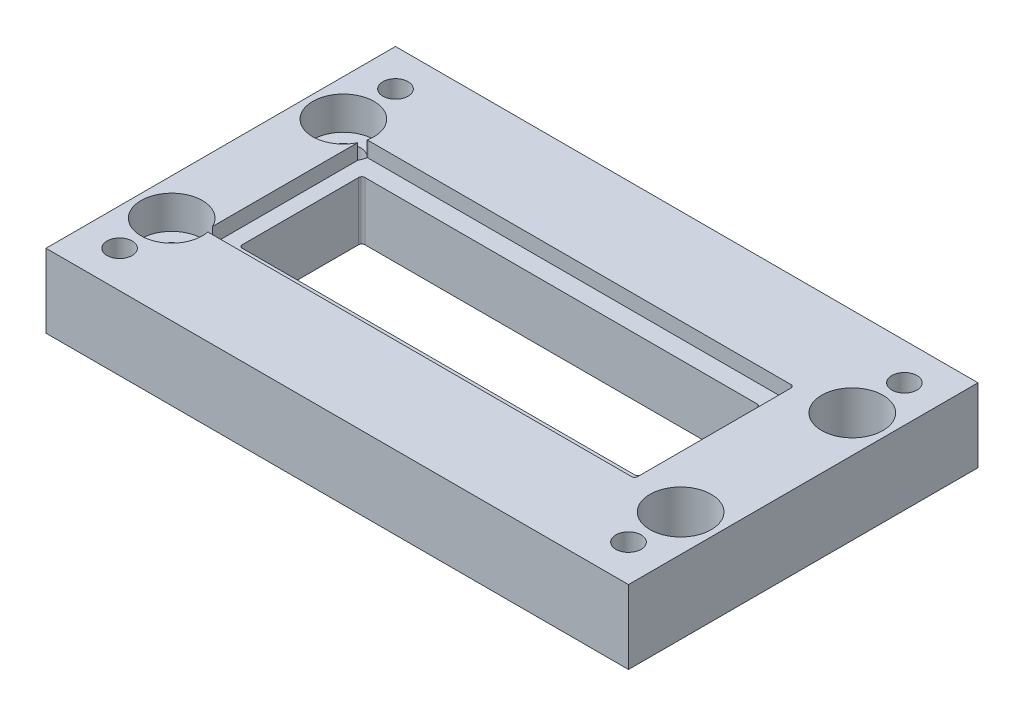
ISO-10303-21;
HEADER;
FILE_DESCRIPTION(('STEP AP214'),'2;1');
FILE_NAME('part.step','',(''),(''),'','','');
FILE_SCHEMA(('AUTOMOTIVE_DESIGN { 1 0 10303 214 1 1 1 1 }'));
ENDSEC;
DATA;
#1=APPLICATION_CONTEXT('core data for automotive mechanical design processes');
#2=APPLICATION_PROTOCOL_DEFINITION('international standard','automotive_design',2000,#1);
#3=PRODUCT_CONTEXT('',#1,'mechanical');
#4=PRODUCT('Part','Part','',(#3));
#5=PRODUCT_RELATED_PRODUCT_CATEGORY('part','',(#4));
#6=PRODUCT_DEFINITION_FORMATION('','',#4);
#7=PRODUCT_DEFINITION_CONTEXT('part definition',#1,'design');
#8=PRODUCT_DEFINITION('design','',#6,#7);
#9=PRODUCT_DEFINITION_SHAPE('','',#8);
#10=(LENGTH_UNIT() NAMED_UNIT(*) SI_UNIT(.MILLI.,.METRE.));
#11=(NAMED_UNIT(*) PLANE_ANGLE_UNIT() SI_UNIT($,.RADIAN.));
#12=(NAMED_UNIT(*) SI_UNIT($,.STERADIAN.) SOLID_ANGLE_UNIT());
#13=UNCERTAINTY_MEASURE_WITH_UNIT(LENGTH_MEASURE(1.E-05),#10,'distance_accuracy_value','');
#14=(GEOMETRIC_REPRESENTATION_CONTEXT(3) GLOBAL_UNCERTAINTY_ASSIGNED_CONTEXT((#13)) GLOBAL_UNIT_ASSIGNED_CONTEXT((#10,
#11,#12)) REPRESENTATION_CONTEXT('',''));
#15=CARTESIAN_POINT('',(0.,0.,0.));
#16=DIRECTION('',(0.,0.,1.));
#17=DIRECTION('',(1.,0.,0.));
#18=AXIS2_PLACEMENT_3D('',#15,#16,#17);
#19=CARTESIAN_POINT('',(-36.5,6.6,-14.));
#20=DIRECTION('',(0.,-1.,0.));
#21=DIRECTION('',(0.,0.,-1.));
#22=AXIS2_PLACEMENT_3D('',#19,#20,#21);
#23=PLANE('',#22);
#24=CARTESIAN_POINT('',(-41.5,6.6,-14.));
#25=DIRECTION('',(0.,1.,0.));
#26=DIRECTION('',(0.,0.,1.));
#27=AXIS2_PLACEMENT_3D('',#24,#25,#26);
#28=CIRCLE('',#27,5.);
#29=CARTESIAN_POINT('',(-41.5,6.6,-9.00000000000001));
#30=VERTEX_POINT('',#29);
#31=EDGE_CURVE('E427',#30,#30,#28,.T.);
#32=ORIENTED_EDGE('',*,*,#31,.T.);
#33=EDGE_LOOP('',(#32));
#34=FACE_BOUND('',#33,.T.);
#35=CARTESIAN_POINT('',(-41.5,6.6,-14.));
#36=DIRECTION('',(0.,1.,0.));
#37=DIRECTION('',(0.,0.,1.));
#38=AXIS2_PLACEMENT_3D('',#35,#36,#37);
#39=CIRCLE('',#38,2.75000000000001);
#40=CARTESIAN_POINT('',(-41.5,6.6,-11.25));
#41=VERTEX_POINT('',#40);
#42=EDGE_CURVE('E763',#41,#41,#39,.T.);
#43=ORIENTED_EDGE('',*,*,#42,.F.);
#44=EDGE_LOOP('',(#43));
#45=FACE_BOUND('',#44,.T.);
#46=ADVANCED_FACE('F49',(#34,#45),#23,.F.);
#47=CARTESIAN_POINT('',(-37.,12.,0.));
#48=DIRECTION('',(1.,0.,0.));
#49=DIRECTION('',(0.,0.,-1.));
#50=AXIS2_PLACEMENT_3D('',#47,#48,#49);
#51=PLANE('',#50);
#52=DIRECTION('',(0.,1.,0.));
#53=VECTOR('',#52,1.);
#54=CARTESIAN_POINT('',(-37.,12.,11.8205505282297));
#55=LINE('',#54,#53);
#56=CARTESIAN_POINT('',(-37.,9.5,11.8205505282297));
#57=VERTEX_POINT('',#56);
#58=CARTESIAN_POINT('',(-37.,12.,11.8205505282297));
#59=VERTEX_POINT('',#58);
#60=EDGE_CURVE('E64',#57,#59,#55,.T.);
#61=ORIENTED_EDGE('',*,*,#60,.F.);
#62=DIRECTION('',(0.,0.,1.));
#63=VECTOR('',#62,1.);
#64=CARTESIAN_POINT('',(-37.,9.5,0.));
#65=LINE('',#64,#63);
#66=CARTESIAN_POINT('',(-37.,9.5,-11.8205505282297));
#67=VERTEX_POINT('',#66);
#68=EDGE_CURVE('E309',#67,#57,#65,.T.);
#69=ORIENTED_EDGE('',*,*,#68,.F.);
#70=DIRECTION('',(0.,1.,0.));
#71=VECTOR('',#70,1.);
#72=CARTESIAN_POINT('',(-37.,12.,-11.8205505282297));
#73=LINE('',#72,#71);
#74=CARTESIAN_POINT('',(-37.,12.,-11.8205505282297));
#75=VERTEX_POINT('',#74);
#76=EDGE_CURVE('E53',#75,#67,#73,.F.);
#77=ORIENTED_EDGE('',*,*,#76,.F.);
#78=DIRECTION('',(0.,0.,1.));
#79=VECTOR('',#78,1.);
#80=CARTESIAN_POINT('',(-37.,12.,0.));
#81=LINE('',#80,#79);
#82=EDGE_CURVE('E386',#75,#59,#81,.T.);
#83=ORIENTED_EDGE('',*,*,#82,.T.);
#84=EDGE_LOOP('',(#61,#69,#77,#83));
#85=FACE_BOUND('',#84,.T.);
#86=ADVANCED_FACE('F420',(#85),#51,.T.);
#87=CARTESIAN_POINT('',(-36.5,12.,-12.5));
#88=DIRECTION('',(0.,-1.,0.));
#89=DIRECTION('',(0.,0.,-1.));
#90=AXIS2_PLACEMENT_3D('',#87,#88,#89);
#91=CYLINDRICAL_SURFACE('',#90,0.500000000000003);
#92=CARTESIAN_POINT('',(-36.5,12.,-12.5));
#93=DIRECTION('',(0.,1.,0.));
#94=DIRECTION('',(0.,0.,1.));
#95=AXIS2_PLACEMENT_3D('',#92,#93,#94);
#96=CIRCLE('',#95,0.500000000000003);
#97=CARTESIAN_POINT('',(-36.6032318616067,12.,-12.9892271279776));
#98=VERTEX_POINT('',#97);
#99=CARTESIAN_POINT('',(-36.5,12.,-13.));
#100=VERTEX_POINT('',#99);
#101=EDGE_CURVE('E388',#98,#100,#96,.F.);
#102=ORIENTED_EDGE('',*,*,#101,.F.);
#103=DIRECTION('',(0.,1.,0.));
#104=VECTOR('',#103,1.);
#105=CARTESIAN_POINT('',(-36.6032318616067,10.35,-12.9892271279776));
#106=LINE('',#105,#104);
#107=CARTESIAN_POINT('',(-36.6032318616067,9.5,-12.9892271279776));
#108=VERTEX_POINT('',#107);
#109=EDGE_CURVE('E72',#98,#108,#106,.F.);
#110=ORIENTED_EDGE('',*,*,#109,.T.);
#111=CARTESIAN_POINT('',(-36.5,9.5,-12.5));
#112=DIRECTION('',(0.,1.,0.));
#113=DIRECTION('',(0.,0.,1.));
#114=AXIS2_PLACEMENT_3D('',#111,#112,#113);
#115=CIRCLE('',#114,0.500000000000003);
#116=CARTESIAN_POINT('',(-36.5,9.5,-13.));
#117=VERTEX_POINT('',#116);
#118=EDGE_CURVE('E307',#108,#117,#115,.F.);
#119=ORIENTED_EDGE('',*,*,#118,.T.);
#120=DIRECTION('',(0.,-1.,0.));
#121=VECTOR('',#120,1.);
#122=CARTESIAN_POINT('',(-36.5,12.,-13.));
#123=LINE('',#122,#121);
#124=EDGE_CURVE('E268',#100,#117,#123,.T.);
#125=ORIENTED_EDGE('',*,*,#124,.F.);
#126=EDGE_LOOP('',(#102,#110,#119,#125));
#127=FACE_BOUND('',#126,.T.);
#128=ADVANCED_FACE('F418',(#127),#91,.F.);
#129=CARTESIAN_POINT('',(0.,12.,-13.));
#130=DIRECTION('',(0.,0.,1.));
#131=DIRECTION('',(1.,0.,0.));
#132=AXIS2_PLACEMENT_3D('',#129,#130,#131);
#133=PLANE('',#132);
#134=DIRECTION('',(-1.,0.,0.));
#135=VECTOR('',#134,1.);
#136=CARTESIAN_POINT('',(0.,9.5,-13.));
#137=LINE('',#136,#135);
#138=CARTESIAN_POINT('',(32.5,9.5,-13.));
#139=VERTEX_POINT('',#138);
#140=EDGE_CURVE('E324',#139,#117,#137,.T.);
#141=ORIENTED_EDGE('',*,*,#140,.F.);
#142=DIRECTION('',(0.,-1.,0.));
#143=VECTOR('',#142,1.);
#144=CARTESIAN_POINT('',(32.5,12.,-13.));
#145=LINE('',#144,#143);
#146=CARTESIAN_POINT('',(32.5,12.,-13.));
#147=VERTEX_POINT('',#146);
#148=EDGE_CURVE('E265',#147,#139,#145,.T.);
#149=ORIENTED_EDGE('',*,*,#148,.F.);
#150=DIRECTION('',(-1.,0.,0.));
#151=VECTOR('',#150,1.);
#152=CARTESIAN_POINT('',(0.,12.,-13.));
#153=LINE('',#152,#151);
#154=EDGE_CURVE('E390',#147,#100,#153,.T.);
#155=ORIENTED_EDGE('',*,*,#154,.T.);
#156=ORIENTED_EDGE('',*,*,#124,.T.);
#157=EDGE_LOOP('',(#141,#149,#155,#156));
#158=FACE_BOUND('',#157,.T.);
#159=ADVANCED_FACE('F414',(#158),#133,.T.);
#160=CARTESIAN_POINT('',(32.5,12.,-12.5));
#161=DIRECTION('',(0.,-1.,0.));
#162=DIRECTION('',(0.,0.,-1.));
#163=AXIS2_PLACEMENT_3D('',#160,#161,#162);
#164=CYLINDRICAL_SURFACE('',#163,0.5);
#165=ORIENTED_EDGE('',*,*,#148,.T.);
#166=CARTESIAN_POINT('',(32.5,9.5,-12.5));
#167=DIRECTION('',(0.,1.,0.));
#168=DIRECTION('',(0.,0.,1.));
#169=AXIS2_PLACEMENT_3D('',#166,#167,#168);
#170=CIRCLE('',#169,0.5);
#171=CARTESIAN_POINT('',(33.,9.5,-12.5));
#172=VERTEX_POINT('',#171);
#173=EDGE_CURVE('E321',#139,#172,#170,.F.);
#174=ORIENTED_EDGE('',*,*,#173,.T.);
#175=DIRECTION('',(0.,-1.,0.));
#176=VECTOR('',#175,1.);
#177=CARTESIAN_POINT('',(33.,12.,-12.5));
#178=LINE('',#177,#176);
#179=CARTESIAN_POINT('',(33.,12.,-12.5));
#180=VERTEX_POINT('',#179);
#181=EDGE_CURVE('E262',#180,#172,#178,.T.);
#182=ORIENTED_EDGE('',*,*,#181,.F.);
#183=CARTESIAN_POINT('',(32.5,12.,-12.5));
#184=DIRECTION('',(0.,1.,0.));
#185=DIRECTION('',(0.,0.,1.));
#186=AXIS2_PLACEMENT_3D('',#183,#184,#185);
#187=CIRCLE('',#186,0.5);
#188=EDGE_CURVE('E393',#147,#180,#187,.F.);
#189=ORIENTED_EDGE('',*,*,#188,.F.);
#190=EDGE_LOOP('',(#165,#174,#182,#189));
#191=FACE_BOUND('',#190,.T.);
#192=ADVANCED_FACE('F412',(#191),#164,.F.);
#193=CARTESIAN_POINT('',(33.,12.,0.));
#194=DIRECTION('',(1.,0.,0.));
#195=DIRECTION('',(0.,0.,-1.));
#196=AXIS2_PLACEMENT_3D('',#193,#194,#195);
#197=PLANE('',#196);
#198=ORIENTED_EDGE('',*,*,#181,.T.);
#199=DIRECTION('',(0.,0.,1.));
#200=VECTOR('',#199,1.);
#201=CARTESIAN_POINT('',(33.,9.5,0.));
#202=LINE('',#201,#200);
#203=CARTESIAN_POINT('',(33.,9.5,12.5));
#204=VERTEX_POINT('',#203);
#205=EDGE_CURVE('E318',#172,#204,#202,.T.);
#206=ORIENTED_EDGE('',*,*,#205,.T.);
#207=DIRECTION('',(0.,-1.,0.));
#208=VECTOR('',#207,1.);
#209=CARTESIAN_POINT('',(33.,12.,12.5));
#210=LINE('',#209,#208);
#211=CARTESIAN_POINT('',(33.,12.,12.5));
#212=VERTEX_POINT('',#211);
#213=EDGE_CURVE('E259',#212,#204,#210,.T.);
#214=ORIENTED_EDGE('',*,*,#213,.F.);
#215=DIRECTION('',(0.,0.,1.));
#216=VECTOR('',#215,1.);
#217=CARTESIAN_POINT('',(33.,12.,0.));
#218=LINE('',#217,#216);
#219=EDGE_CURVE('E396',#180,#212,#218,.T.);
#220=ORIENTED_EDGE('',*,*,#219,.F.);
#221=EDGE_LOOP('',(#198,#206,#214,#220));
#222=FACE_BOUND('',#221,.T.);
#223=ADVANCED_FACE('F406',(#222),#197,.F.);
#224=CARTESIAN_POINT('',(32.5,12.,12.5));
#225=DIRECTION('',(0.,-1.,0.));
#226=DIRECTION('',(0.,0.,-1.));
#227=AXIS2_PLACEMENT_3D('',#224,#225,#226);
#228=CYLINDRICAL_SURFACE('',#227,0.5);
#229=CARTESIAN_POINT('',(32.5,9.5,12.5));
#230=DIRECTION('',(0.,1.,0.));
#231=DIRECTION('',(0.,0.,1.));
#232=AXIS2_PLACEMENT_3D('',#229,#230,#231);
#233=CIRCLE('',#232,0.5);
#234=CARTESIAN_POINT('',(32.5,9.5,13.));
#235=VERTEX_POINT('',#234);
#236=EDGE_CURVE('E316',#235,#204,#233,.T.);
#237=ORIENTED_EDGE('',*,*,#236,.F.);
#238=DIRECTION('',(0.,-1.,0.));
#239=VECTOR('',#238,1.);
#240=CARTESIAN_POINT('',(32.5,12.,13.));
#241=LINE('',#240,#239);
#242=CARTESIAN_POINT('',(32.5,12.,13.));
#243=VERTEX_POINT('',#242);
#244=EDGE_CURVE('E255',#243,#235,#241,.T.);
#245=ORIENTED_EDGE('',*,*,#244,.F.);
#246=CARTESIAN_POINT('',(32.5,12.,12.5));
#247=DIRECTION('',(0.,1.,0.));
#248=DIRECTION('',(0.,0.,1.));
#249=AXIS2_PLACEMENT_3D('',#246,#247,#248);
#250=CIRCLE('',#249,0.5);
#251=EDGE_CURVE('E223',#243,#212,#250,.T.);
#252=ORIENTED_EDGE('',*,*,#251,.T.);
#253=ORIENTED_EDGE('',*,*,#213,.T.);
#254=EDGE_LOOP('',(#237,#245,#252,#253));
#255=FACE_BOUND('',#254,.T.);
#256=ADVANCED_FACE('F400',(#255),#228,.F.);
#257=CARTESIAN_POINT('',(0.,12.,13.));
#258=DIRECTION('',(0.,0.,1.));
#259=DIRECTION('',(1.,0.,0.));
#260=AXIS2_PLACEMENT_3D('',#257,#258,#259);
#261=PLANE('',#260);
#262=ORIENTED_EDGE('',*,*,#244,.T.);
#263=DIRECTION('',(-1.,0.,0.));
#264=VECTOR('',#263,1.);
#265=CARTESIAN_POINT('',(0.,9.5,13.));
#266=LINE('',#265,#264);
#267=CARTESIAN_POINT('',(-36.5,9.5,13.));
#268=VERTEX_POINT('',#267);
#269=EDGE_CURVE('E313',#235,#268,#266,.T.);
#270=ORIENTED_EDGE('',*,*,#269,.T.);
#271=DIRECTION('',(0.,-1.,0.));
#272=VECTOR('',#271,1.);
#273=CARTESIAN_POINT('',(-36.5,12.,13.));
#274=LINE('',#273,#272);
#275=CARTESIAN_POINT('',(-36.5,12.,13.));
#276=VERTEX_POINT('',#275);
#277=EDGE_CURVE('E253',#276,#268,#274,.T.);
#278=ORIENTED_EDGE('',*,*,#277,.F.);
#279=DIRECTION('',(-1.,0.,0.));
#280=VECTOR('',#279,1.);
#281=CARTESIAN_POINT('',(0.,12.,13.));
#282=LINE('',#281,#280);
#283=EDGE_CURVE('E217',#243,#276,#282,.T.);
#284=ORIENTED_EDGE('',*,*,#283,.F.);
#285=EDGE_LOOP('',(#262,#270,#278,#284));
#286=FACE_BOUND('',#285,.T.);
#287=ADVANCED_FACE('F447',(#286),#261,.F.);
#288=CARTESIAN_POINT('',(0.,12.,-28.5));
#289=DIRECTION('',(0.,0.,1.));
#290=DIRECTION('',(1.,0.,0.));
#291=AXIS2_PLACEMENT_3D('',#288,#289,#290);
#292=PLANE('',#291);
#293=DIRECTION('',(-1.,0.,0.));
#294=VECTOR('',#293,1.);
#295=CARTESIAN_POINT('',(0.,0.,-28.5));
#296=LINE('',#295,#294);
#297=CARTESIAN_POINT('',(47.5,0.,-28.5));
#298=VERTEX_POINT('',#297);
#299=CARTESIAN_POINT('',(-47.5,0.,-28.5));
#300=VERTEX_POINT('',#299);
#301=EDGE_CURVE('E240',#298,#300,#296,.T.);
#302=ORIENTED_EDGE('',*,*,#301,.T.);
#303=DIRECTION('',(0.,-1.,0.));
#304=VECTOR('',#303,1.);
#305=CARTESIAN_POINT('',(-47.5,12.,-28.5));
#306=LINE('',#305,#304);
#307=CARTESIAN_POINT('',(-47.5,12.,-28.5));
#308=VERTEX_POINT('',#307);
#309=EDGE_CURVE('E256',#308,#300,#306,.T.);
#310=ORIENTED_EDGE('',*,*,#309,.F.);
#311=DIRECTION('',(-1.,0.,0.));
#312=VECTOR('',#311,1.);
#313=CARTESIAN_POINT('',(0.,12.,-28.5));
#314=LINE('',#313,#312);
#315=CARTESIAN_POINT('',(47.5,12.,-28.5));
#316=VERTEX_POINT('',#315);
#317=EDGE_CURVE('E375',#316,#308,#314,.T.);
#318=ORIENTED_EDGE('',*,*,#317,.F.);
#319=DIRECTION('',(0.,-1.,0.));
#320=VECTOR('',#319,1.);
#321=CARTESIAN_POINT('',(47.5,12.,-28.5));
#322=LINE('',#321,#320);
#323=EDGE_CURVE('E219',#316,#298,#322,.T.);
#324=ORIENTED_EDGE('',*,*,#323,.T.);
#325=EDGE_LOOP('',(#302,#310,#318,#324));
#326=FACE_BOUND('',#325,.T.);
#327=ADVANCED_FACE('F449',(#326),#292,.F.);
#328=CARTESIAN_POINT('',(-47.5,12.,0.));
#329=DIRECTION('',(1.,0.,0.));
#330=DIRECTION('',(0.,0.,-1.));
#331=AXIS2_PLACEMENT_3D('',#328,#329,#330);
#332=PLANE('',#331);
#333=DIRECTION('',(0.,0.,1.));
#334=VECTOR('',#333,1.);
#335=CARTESIAN_POINT('',(-47.5,0.,0.));
#336=LINE('',#335,#334);
#337=CARTESIAN_POINT('',(-47.5,0.,28.5));
#338=VERTEX_POINT('',#337);
#339=EDGE_CURVE('E243',#300,#338,#336,.T.);
#340=ORIENTED_EDGE('',*,*,#339,.T.);
#341=DIRECTION('',(0.,-1.,0.));
#342=VECTOR('',#341,1.);
#343=CARTESIAN_POINT('',(-47.5,12.,28.5));
#344=LINE('',#343,#342);
#345=CARTESIAN_POINT('',(-47.5,12.,28.5));
#346=VERTEX_POINT('',#345);
#347=EDGE_CURVE('E273',#346,#338,#344,.T.);
#348=ORIENTED_EDGE('',*,*,#347,.F.);
#349=DIRECTION('',(0.,0.,1.));
#350=VECTOR('',#349,1.);
#351=CARTESIAN_POINT('',(-47.5,12.,0.));
#352=LINE('',#351,#350);
#353=EDGE_CURVE('E378',#308,#346,#352,.T.);
#354=ORIENTED_EDGE('',*,*,#353,.F.);
#355=ORIENTED_EDGE('',*,*,#309,.T.);
#356=EDGE_LOOP('',(#340,#348,#354,#355));
#357=FACE_BOUND('',#356,.T.);
#358=ADVANCED_FACE('F455',(#357),#332,.F.);
#359=CARTESIAN_POINT('',(0.,12.,28.5));
#360=DIRECTION('',(0.,0.,1.));
#361=DIRECTION('',(1.,0.,0.));
#362=AXIS2_PLACEMENT_3D('',#359,#360,#361);
#363=PLANE('',#362);
#364=DIRECTION('',(-1.,0.,0.));
#365=VECTOR('',#364,1.);
#366=CARTESIAN_POINT('',(0.,0.,28.5));
#367=LINE('',#366,#365);
#368=CARTESIAN_POINT('',(47.5,0.,28.5));
#369=VERTEX_POINT('',#368);
#370=EDGE_CURVE('E246',#369,#338,#367,.T.);
#371=ORIENTED_EDGE('',*,*,#370,.F.);
#372=DIRECTION('',(0.,-1.,0.));
#373=VECTOR('',#372,1.);
#374=CARTESIAN_POINT('',(47.5,12.,28.5));
#375=LINE('',#374,#373);
#376=CARTESIAN_POINT('',(47.5,12.,28.5));
#377=VERTEX_POINT('',#376);
#378=EDGE_CURVE('E221',#377,#369,#375,.T.);
#379=ORIENTED_EDGE('',*,*,#378,.F.);
#380=DIRECTION('',(-1.,0.,0.));
#381=VECTOR('',#380,1.);
#382=CARTESIAN_POINT('',(0.,12.,28.5));
#383=LINE('',#382,#381);
#384=EDGE_CURVE('E380',#377,#346,#383,.T.);
#385=ORIENTED_EDGE('',*,*,#384,.T.);
#386=ORIENTED_EDGE('',*,*,#347,.T.);
#387=EDGE_LOOP('',(#371,#379,#385,#386));
#388=FACE_BOUND('',#387,.T.);
#389=ADVANCED_FACE('F577',(#388),#363,.T.);
#390=CARTESIAN_POINT('',(47.5,12.,0.));
#391=DIRECTION('',(1.,0.,0.));
#392=DIRECTION('',(0.,0.,-1.));
#393=AXIS2_PLACEMENT_3D('',#390,#391,#392);
#394=PLANE('',#393);
#395=DIRECTION('',(0.,0.,1.));
#396=VECTOR('',#395,1.);
#397=CARTESIAN_POINT('',(47.5,0.,0.));
#398=LINE('',#397,#396);
#399=EDGE_CURVE('E249',#298,#369,#398,.T.);
#400=ORIENTED_EDGE('',*,*,#399,.F.);
#401=ORIENTED_EDGE('',*,*,#323,.F.);
#402=DIRECTION('',(0.,0.,1.));
#403=VECTOR('',#402,1.);
#404=CARTESIAN_POINT('',(47.5,12.,0.));
#405=LINE('',#404,#403);
#406=EDGE_CURVE('E383',#316,#377,#405,.T.);
#407=ORIENTED_EDGE('',*,*,#406,.T.);
#408=ORIENTED_EDGE('',*,*,#378,.T.);
#409=EDGE_LOOP('',(#400,#401,#407,#408));
#410=FACE_BOUND('',#409,.T.);
#411=ADVANCED_FACE('F571',(#410),#394,.T.);
#412=CARTESIAN_POINT('',(-41.5,12.,22.5));
#413=DIRECTION('',(0.,-1.,0.));
#414=DIRECTION('',(0.,0.,-1.));
#415=AXIS2_PLACEMENT_3D('',#412,#413,#414);
#416=CYLINDRICAL_SURFACE('',#415,2.05798302171012);
#417=CARTESIAN_POINT('',(-41.5,12.,22.5));
#418=DIRECTION('',(0.,1.,0.));
#419=DIRECTION('',(0.,0.,1.));
#420=AXIS2_PLACEMENT_3D('',#417,#418,#419);
#421=CIRCLE('',#420,2.05798302171012);
#422=CARTESIAN_POINT('',(-41.5,12.,24.5579830217101));
#423=VERTEX_POINT('',#422);
#424=EDGE_CURVE('E372',#423,#423,#421,.T.);
#425=ORIENTED_EDGE('',*,*,#424,.T.);
#426=EDGE_LOOP('',(#425));
#427=FACE_BOUND('',#426,.T.);
#428=CARTESIAN_POINT('',(-41.5,0.,22.5));
#429=DIRECTION('',(0.,1.,0.));
#430=DIRECTION('',(0.,0.,1.));
#431=AXIS2_PLACEMENT_3D('',#428,#429,#430);
#432=CIRCLE('',#431,2.05798302171012);
#433=CARTESIAN_POINT('',(-41.5,0.,24.5579830217101));
#434=VERTEX_POINT('',#433);
#435=EDGE_CURVE('E237',#434,#434,#432,.T.);
#436=ORIENTED_EDGE('',*,*,#435,.F.);
#437=EDGE_LOOP('',(#436));
#438=FACE_BOUND('',#437,.T.);
#439=ADVANCED_FACE('F589',(#427,#438),#416,.F.);
#440=CARTESIAN_POINT('',(41.5,12.,22.5));
#441=DIRECTION('',(0.,-1.,0.));
#442=DIRECTION('',(0.,0.,-1.));
#443=AXIS2_PLACEMENT_3D('',#440,#441,#442);
#444=CYLINDRICAL_SURFACE('',#443,2.05798302171012);
#445=CARTESIAN_POINT('',(41.5,12.,22.5));
#446=DIRECTION('',(0.,1.,0.));
#447=DIRECTION('',(0.,0.,1.));
#448=AXIS2_PLACEMENT_3D('',#445,#446,#447);
#449=CIRCLE('',#448,2.05798302171012);
#450=CARTESIAN_POINT('',(41.5,12.,24.5579830217101));
#451=VERTEX_POINT('',#450);
#452=EDGE_CURVE('E369',#451,#451,#449,.T.);
#453=ORIENTED_EDGE('',*,*,#452,.T.);
#454=EDGE_LOOP('',(#453));
#455=FACE_BOUND('',#454,.T.);
#456=CARTESIAN_POINT('',(41.5,0.,22.5));
#457=DIRECTION('',(0.,1.,0.));
#458=DIRECTION('',(0.,0.,1.));
#459=AXIS2_PLACEMENT_3D('',#456,#457,#458);
#460=CIRCLE('',#459,2.05798302171012);
#461=CARTESIAN_POINT('',(41.5,0.,24.5579830217101));
#462=VERTEX_POINT('',#461);
#463=EDGE_CURVE('E234',#462,#462,#460,.T.);
#464=ORIENTED_EDGE('',*,*,#463,.F.);
#465=EDGE_LOOP('',(#464));
#466=FACE_BOUND('',#465,.T.);
#467=ADVANCED_FACE('F534',(#455,#466),#444,.F.);
#468=CARTESIAN_POINT('',(-41.5,12.,-22.5));
#469=DIRECTION('',(0.,-1.,0.));
#470=DIRECTION('',(0.,0.,-1.));
#471=AXIS2_PLACEMENT_3D('',#468,#469,#470);
#472=CYLINDRICAL_SURFACE('',#471,2.05798302171012);
#473=CARTESIAN_POINT('',(-41.5,12.,-22.5));
#474=DIRECTION('',(0.,1.,0.));
#475=DIRECTION('',(0.,0.,1.));
#476=AXIS2_PLACEMENT_3D('',#473,#474,#475);
#477=CIRCLE('',#476,2.05798302171012);
#478=CARTESIAN_POINT('',(-41.5,12.,-20.4420169782899));
#479=VERTEX_POINT('',#478);
#480=EDGE_CURVE('E366',#479,#479,#477,.T.);
#481=ORIENTED_EDGE('',*,*,#480,.T.);
#482=EDGE_LOOP('',(#481));
#483=FACE_BOUND('',#482,.T.);
#484=CARTESIAN_POINT('',(-41.5,0.,-22.5));
#485=DIRECTION('',(0.,1.,0.));
#486=DIRECTION('',(0.,0.,1.));
#487=AXIS2_PLACEMENT_3D('',#484,#485,#486);
#488=CIRCLE('',#487,2.05798302171012);
#489=CARTESIAN_POINT('',(-41.5,0.,-20.4420169782899));
#490=VERTEX_POINT('',#489);
#491=EDGE_CURVE('E230',#490,#490,#488,.T.);
#492=ORIENTED_EDGE('',*,*,#491,.F.);
#493=EDGE_LOOP('',(#492));
#494=FACE_BOUND('',#493,.T.);
#495=ADVANCED_FACE('F529',(#483,#494),#472,.F.);
#496=CARTESIAN_POINT('',(41.5,12.,-22.5));
#497=DIRECTION('',(0.,-1.,0.));
#498=DIRECTION('',(0.,0.,-1.));
#499=AXIS2_PLACEMENT_3D('',#496,#497,#498);
#500=CYLINDRICAL_SURFACE('',#499,2.05798302171012);
#501=CARTESIAN_POINT('',(41.5,12.,-22.5));
#502=DIRECTION('',(0.,1.,0.));
#503=DIRECTION('',(0.,0.,1.));
#504=AXIS2_PLACEMENT_3D('',#501,#502,#503);
#505=CIRCLE('',#504,2.05798302171012);
#506=CARTESIAN_POINT('',(41.5,12.,-20.4420169782899));
#507=VERTEX_POINT('',#506);
#508=EDGE_CURVE('E252',#507,#507,#505,.T.);
#509=ORIENTED_EDGE('',*,*,#508,.T.);
#510=EDGE_LOOP('',(#509));
#511=FACE_BOUND('',#510,.T.);
#512=CARTESIAN_POINT('',(41.5,0.,-22.5));
#513=DIRECTION('',(0.,1.,0.));
#514=DIRECTION('',(0.,0.,1.));
#515=AXIS2_PLACEMENT_3D('',#512,#513,#514);
#516=CIRCLE('',#515,2.05798302171012);
#517=CARTESIAN_POINT('',(41.5,0.,-20.4420169782899));
#518=VERTEX_POINT('',#517);
#519=EDGE_CURVE('E227',#518,#518,#516,.T.);
#520=ORIENTED_EDGE('',*,*,#519,.F.);
#521=EDGE_LOOP('',(#520));
#522=FACE_BOUND('',#521,.T.);
#523=ADVANCED_FACE('F51',(#511,#522),#500,.F.);
#524=CARTESIAN_POINT('',(-36.5,12.,12.5));
#525=DIRECTION('',(0.,-1.,0.));
#526=DIRECTION('',(0.,0.,-1.));
#527=AXIS2_PLACEMENT_3D('',#524,#525,#526);
#528=CYLINDRICAL_SURFACE('',#527,0.5);
#529=CARTESIAN_POINT('',(-36.5,9.5,12.5));
#530=DIRECTION('',(0.,1.,0.));
#531=DIRECTION('',(0.,0.,1.));
#532=AXIS2_PLACEMENT_3D('',#529,#530,#531);
#533=CIRCLE('',#532,0.5);
#534=CARTESIAN_POINT('',(-36.6032318616067,9.5,12.9892271279776));
#535=VERTEX_POINT('',#534);
#536=EDGE_CURVE('E210',#268,#535,#533,.F.);
#537=ORIENTED_EDGE('',*,*,#536,.T.);
#538=DIRECTION('',(0.,1.,0.));
#539=VECTOR('',#538,1.);
#540=CARTESIAN_POINT('',(-36.6032318616067,10.35,12.9892271279776));
#541=LINE('',#540,#539);
#542=CARTESIAN_POINT('',(-36.6032318616067,12.,12.9892271279776));
#543=VERTEX_POINT('',#542);
#544=EDGE_CURVE('E198',#535,#543,#541,.T.);
#545=ORIENTED_EDGE('',*,*,#544,.T.);
#546=CARTESIAN_POINT('',(-36.5,12.,12.5));
#547=DIRECTION('',(0.,1.,0.));
#548=DIRECTION('',(0.,0.,1.));
#549=AXIS2_PLACEMENT_3D('',#546,#547,#548);
#550=CIRCLE('',#549,0.5);
#551=EDGE_CURVE('E208',#276,#543,#550,.F.);
#552=ORIENTED_EDGE('',*,*,#551,.F.);
#553=ORIENTED_EDGE('',*,*,#277,.T.);
#554=EDGE_LOOP('',(#537,#545,#552,#553));
#555=FACE_BOUND('',#554,.T.);
#556=ADVANCED_FACE('F206',(#555),#528,.F.);
#557=CARTESIAN_POINT('',(0.,12.,0.));
#558=DIRECTION('',(0.,1.,0.));
#559=DIRECTION('',(0.,0.,1.));
#560=AXIS2_PLACEMENT_3D('',#557,#558,#559);
#561=PLANE('',#560);
#562=CARTESIAN_POINT('',(41.5,12.,14.));
#563=DIRECTION('',(0.,1.,0.));
#564=DIRECTION('',(0.,0.,1.));
#565=AXIS2_PLACEMENT_3D('',#562,#563,#564);
#566=CIRCLE('',#565,5.);
#567=CARTESIAN_POINT('',(41.5,12.,19.));
#568=VERTEX_POINT('',#567);
#569=EDGE_CURVE('E433',#568,#568,#566,.T.);
#570=ORIENTED_EDGE('',*,*,#569,.F.);
#571=EDGE_LOOP('',(#570));
#572=FACE_BOUND('',#571,.T.);
#573=CARTESIAN_POINT('',(41.5,12.,-14.));
#574=DIRECTION('',(0.,1.,0.));
#575=DIRECTION('',(0.,0.,1.));
#576=AXIS2_PLACEMENT_3D('',#573,#574,#575);
#577=CIRCLE('',#576,5.);
#578=CARTESIAN_POINT('',(41.5,12.,-9.00000000000001));
#579=VERTEX_POINT('',#578);
#580=EDGE_CURVE('E442',#579,#579,#577,.T.);
#581=ORIENTED_EDGE('',*,*,#580,.F.);
#582=EDGE_LOOP('',(#581));
#583=FACE_BOUND('',#582,.T.);
#584=CARTESIAN_POINT('',(-41.5,12.,14.));
#585=DIRECTION('',(0.,1.,0.));
#586=DIRECTION('',(0.,0.,1.));
#587=AXIS2_PLACEMENT_3D('',#584,#585,#586);
#588=CIRCLE('',#587,5.);
#589=EDGE_CURVE('E13',#59,#543,#588,.T.);
#590=ORIENTED_EDGE('',*,*,#589,.F.);
#591=ORIENTED_EDGE('',*,*,#82,.F.);
#592=CARTESIAN_POINT('',(-41.5,12.,-14.));
#593=DIRECTION('',(0.,1.,0.));
#594=DIRECTION('',(0.,0.,1.));
#595=AXIS2_PLACEMENT_3D('',#592,#593,#594);
#596=CIRCLE('',#595,5.);
#597=EDGE_CURVE('E270',#98,#75,#596,.T.);
#598=ORIENTED_EDGE('',*,*,#597,.F.);
#599=ORIENTED_EDGE('',*,*,#101,.T.);
#600=ORIENTED_EDGE('',*,*,#154,.F.);
#601=ORIENTED_EDGE('',*,*,#188,.T.);
#602=ORIENTED_EDGE('',*,*,#219,.T.);
#603=ORIENTED_EDGE('',*,*,#251,.F.);
#604=ORIENTED_EDGE('',*,*,#283,.T.);
#605=ORIENTED_EDGE('',*,*,#551,.T.);
#606=EDGE_LOOP('',(#590,#591,#598,#599,#600,#601,#602,#603,#604,#605));
#607=FACE_BOUND('',#606,.T.);
#608=ORIENTED_EDGE('',*,*,#508,.F.);
#609=EDGE_LOOP('',(#608));
#610=FACE_BOUND('',#609,.T.);
#611=ORIENTED_EDGE('',*,*,#480,.F.);
#612=EDGE_LOOP('',(#611));
#613=FACE_BOUND('',#612,.T.);
#614=ORIENTED_EDGE('',*,*,#452,.F.);
#615=EDGE_LOOP('',(#614));
#616=FACE_BOUND('',#615,.T.);
#617=ORIENTED_EDGE('',*,*,#424,.F.);
#618=EDGE_LOOP('',(#617));
#619=FACE_BOUND('',#618,.T.);
#620=ORIENTED_EDGE('',*,*,#317,.T.);
#621=ORIENTED_EDGE('',*,*,#353,.T.);
#622=ORIENTED_EDGE('',*,*,#384,.F.);
#623=ORIENTED_EDGE('',*,*,#406,.F.);
#624=EDGE_LOOP('',(#620,#621,#622,#623));
#625=FACE_BOUND('',#624,.T.);
#626=ADVANCED_FACE('F213',(#572,#583,#607,#610,#613,#616,#619,#625),#561,.T.);
#627=CARTESIAN_POINT('',(0.,0.,0.));
#628=DIRECTION('',(0.,1.,0.));
#629=DIRECTION('',(0.,0.,1.));
#630=AXIS2_PLACEMENT_3D('',#627,#628,#629);
#631=PLANE('',#630);
#632=CARTESIAN_POINT('',(41.5,0.,-14.));
#633=DIRECTION('',(0.,1.,0.));
#634=DIRECTION('',(0.,0.,1.));
#635=AXIS2_PLACEMENT_3D('',#632,#633,#634);
#636=CIRCLE('',#635,2.75);
#637=CARTESIAN_POINT('',(41.5,0.,-11.25));
#638=VERTEX_POINT('',#637);
#639=EDGE_CURVE('E758',#638,#638,#636,.T.);
#640=ORIENTED_EDGE('',*,*,#639,.T.);
#641=EDGE_LOOP('',(#640));
#642=FACE_BOUND('',#641,.T.);
#643=CARTESIAN_POINT('',(-41.5,0.,-14.));
#644=DIRECTION('',(0.,1.,0.));
#645=DIRECTION('',(0.,0.,1.));
#646=AXIS2_PLACEMENT_3D('',#643,#644,#645);
#647=CIRCLE('',#646,2.75000000000001);
#648=CARTESIAN_POINT('',(-41.5,0.,-11.25));
#649=VERTEX_POINT('',#648);
#650=EDGE_CURVE('E766',#649,#649,#647,.T.);
#651=ORIENTED_EDGE('',*,*,#650,.T.);
#652=EDGE_LOOP('',(#651));
#653=FACE_BOUND('',#652,.T.);
#654=CARTESIAN_POINT('',(41.5,0.,14.));
#655=DIRECTION('',(0.,1.,0.));
#656=DIRECTION('',(0.,0.,1.));
#657=AXIS2_PLACEMENT_3D('',#654,#655,#656);
#658=CIRCLE('',#657,2.75);
#659=CARTESIAN_POINT('',(41.5,0.,16.75));
#660=VERTEX_POINT('',#659);
#661=EDGE_CURVE('E775',#660,#660,#658,.T.);
#662=ORIENTED_EDGE('',*,*,#661,.T.);
#663=EDGE_LOOP('',(#662));
#664=FACE_BOUND('',#663,.T.);
#665=CARTESIAN_POINT('',(-41.5,0.,14.));
#666=DIRECTION('',(0.,1.,0.));
#667=DIRECTION('',(0.,0.,1.));
#668=AXIS2_PLACEMENT_3D('',#665,#666,#667);
#669=CIRCLE('',#668,2.75);
#670=CARTESIAN_POINT('',(-41.5,0.,16.75));
#671=VERTEX_POINT('',#670);
#672=EDGE_CURVE('E430',#671,#671,#669,.T.);
#673=ORIENTED_EDGE('',*,*,#672,.T.);
#674=EDGE_LOOP('',(#673));
#675=FACE_BOUND('',#674,.T.);
#676=ORIENTED_EDGE('',*,*,#519,.T.);
#677=EDGE_LOOP('',(#676));
#678=FACE_BOUND('',#677,.T.);
#679=ORIENTED_EDGE('',*,*,#491,.T.);
#680=EDGE_LOOP('',(#679));
#681=FACE_BOUND('',#680,.T.);
#682=ORIENTED_EDGE('',*,*,#463,.T.);
#683=EDGE_LOOP('',(#682));
#684=FACE_BOUND('',#683,.T.);
#685=ORIENTED_EDGE('',*,*,#435,.T.);
#686=EDGE_LOOP('',(#685));
#687=FACE_BOUND('',#686,.T.);
#688=ORIENTED_EDGE('',*,*,#301,.F.);
#689=ORIENTED_EDGE('',*,*,#399,.T.);
#690=ORIENTED_EDGE('',*,*,#370,.T.);
#691=ORIENTED_EDGE('',*,*,#339,.F.);
#692=EDGE_LOOP('',(#688,#689,#690,#691));
#693=FACE_BOUND('',#692,.T.);
#694=CARTESIAN_POINT('',(30.,0.,9.49999999999999));
#695=DIRECTION('',(0.,1.,0.));
#696=DIRECTION('',(0.,0.,1.));
#697=AXIS2_PLACEMENT_3D('',#694,#695,#696);
#698=CIRCLE('',#697,0.5);
#699=CARTESIAN_POINT('',(30.,0.,9.99999999999999));
#700=VERTEX_POINT('',#699);
#701=CARTESIAN_POINT('',(30.5,0.,9.49999999999999));
#702=VERTEX_POINT('',#701);
#703=EDGE_CURVE('E284',#700,#702,#698,.T.);
#704=ORIENTED_EDGE('',*,*,#703,.T.);
#705=DIRECTION('',(0.,0.,-1.));
#706=VECTOR('',#705,1.);
#707=CARTESIAN_POINT('',(30.5,0.,0.));
#708=LINE('',#707,#706);
#709=CARTESIAN_POINT('',(30.5,0.,-9.5));
#710=VERTEX_POINT('',#709);
#711=EDGE_CURVE('E289',#702,#710,#708,.T.);
#712=ORIENTED_EDGE('',*,*,#711,.T.);
#713=CARTESIAN_POINT('',(30.,0.,-9.50000000000001));
#714=DIRECTION('',(0.,1.,0.));
#715=DIRECTION('',(0.,0.,1.));
#716=AXIS2_PLACEMENT_3D('',#713,#714,#715);
#717=CIRCLE('',#716,0.5);
#718=CARTESIAN_POINT('',(30.,0.,-10.));
#719=VERTEX_POINT('',#718);
#720=EDGE_CURVE('E343',#710,#719,#717,.T.);
#721=ORIENTED_EDGE('',*,*,#720,.T.);
#722=DIRECTION('',(-1.,0.,0.));
#723=VECTOR('',#722,1.);
#724=CARTESIAN_POINT('',(0.,0.,-10.));
#725=LINE('',#724,#723);
#726=CARTESIAN_POINT('',(-34.,0.,-10.));
#727=VERTEX_POINT('',#726);
#728=EDGE_CURVE('E340',#719,#727,#725,.T.);
#729=ORIENTED_EDGE('',*,*,#728,.T.);
#730=CARTESIAN_POINT('',(-34.,0.,-9.5));
#731=DIRECTION('',(0.,1.,0.));
#732=DIRECTION('',(0.,0.,1.));
#733=AXIS2_PLACEMENT_3D('',#730,#731,#732);
#734=CIRCLE('',#733,0.5);
#735=CARTESIAN_POINT('',(-34.5,0.,-9.49999999999999));
#736=VERTEX_POINT('',#735);
#737=EDGE_CURVE('E337',#727,#736,#734,.T.);
#738=ORIENTED_EDGE('',*,*,#737,.T.);
#739=DIRECTION('',(0.,0.,-1.));
#740=VECTOR('',#739,1.);
#741=CARTESIAN_POINT('',(-34.5,0.,0.));
#742=LINE('',#741,#740);
#743=CARTESIAN_POINT('',(-34.5,0.,9.5));
#744=VERTEX_POINT('',#743);
#745=EDGE_CURVE('E334',#744,#736,#742,.T.);
#746=ORIENTED_EDGE('',*,*,#745,.F.);
#747=CARTESIAN_POINT('',(-34.,0.,9.5));
#748=DIRECTION('',(0.,1.,0.));
#749=DIRECTION('',(0.,0.,1.));
#750=AXIS2_PLACEMENT_3D('',#747,#748,#749);
#751=CIRCLE('',#750,0.5);
#752=CARTESIAN_POINT('',(-34.,0.,10.));
#753=VERTEX_POINT('',#752);
#754=EDGE_CURVE('E332',#753,#744,#751,.F.);
#755=ORIENTED_EDGE('',*,*,#754,.F.);
#756=DIRECTION('',(-1.,0.,0.));
#757=VECTOR('',#756,1.);
#758=CARTESIAN_POINT('',(0.,0.,10.));
#759=LINE('',#758,#757);
#760=EDGE_CURVE('E330',#700,#753,#759,.T.);
#761=ORIENTED_EDGE('',*,*,#760,.F.);
#762=EDGE_LOOP('',(#704,#712,#721,#729,#738,#746,#755,#761));
#763=FACE_BOUND('',#762,.T.);
#764=ADVANCED_FACE('F518',(#642,#653,#664,#675,#678,#681,#684,#687,#693,#763),#631,.F.);
#765=CARTESIAN_POINT('',(30.,9.5,9.49999999999999));
#766=DIRECTION('',(0.,-1.,0.));
#767=DIRECTION('',(0.,0.,-1.));
#768=AXIS2_PLACEMENT_3D('',#765,#766,#767);
#769=CYLINDRICAL_SURFACE('',#768,0.5);
#770=ORIENTED_EDGE('',*,*,#703,.F.);
#771=DIRECTION('',(0.,-1.,0.));
#772=VECTOR('',#771,1.);
#773=CARTESIAN_POINT('',(30.,9.5,9.99999999999999));
#774=LINE('',#773,#772);
#775=CARTESIAN_POINT('',(30.,9.5,9.99999999999999));
#776=VERTEX_POINT('',#775);
#777=EDGE_CURVE('E231',#776,#700,#774,.T.);
#778=ORIENTED_EDGE('',*,*,#777,.F.);
#779=CARTESIAN_POINT('',(30.,9.5,9.49999999999999));
#780=DIRECTION('',(0.,1.,0.));
#781=DIRECTION('',(0.,0.,1.));
#782=AXIS2_PLACEMENT_3D('',#779,#780,#781);
#783=CIRCLE('',#782,0.5);
#784=CARTESIAN_POINT('',(30.5,9.5,9.49999999999999));
#785=VERTEX_POINT('',#784);
#786=EDGE_CURVE('E285',#776,#785,#783,.T.);
#787=ORIENTED_EDGE('',*,*,#786,.T.);
#788=DIRECTION('',(0.,-1.,0.));
#789=VECTOR('',#788,1.);
#790=CARTESIAN_POINT('',(30.5,9.5,9.49999999999999));
#791=LINE('',#790,#789);
#792=EDGE_CURVE('E327',#785,#702,#791,.T.);
#793=ORIENTED_EDGE('',*,*,#792,.T.);
#794=EDGE_LOOP('',(#770,#778,#787,#793));
#795=FACE_BOUND('',#794,.T.);
#796=ADVANCED_FACE('F514',(#795),#769,.F.);
#797=CARTESIAN_POINT('',(0.,9.5,10.));
#798=DIRECTION('',(0.,0.,1.));
#799=DIRECTION('',(1.,0.,0.));
#800=AXIS2_PLACEMENT_3D('',#797,#798,#799);
#801=PLANE('',#800);
#802=ORIENTED_EDGE('',*,*,#760,.T.);
#803=DIRECTION('',(0.,-1.,0.));
#804=VECTOR('',#803,1.);
#805=CARTESIAN_POINT('',(-34.,9.5,10.));
#806=LINE('',#805,#804);
#807=CARTESIAN_POINT('',(-34.,9.5,10.));
#808=VERTEX_POINT('',#807);
#809=EDGE_CURVE('E360',#808,#753,#806,.T.);
#810=ORIENTED_EDGE('',*,*,#809,.F.);
#811=DIRECTION('',(-1.,0.,0.));
#812=VECTOR('',#811,1.);
#813=CARTESIAN_POINT('',(0.,9.5,10.));
#814=LINE('',#813,#812);
#815=EDGE_CURVE('E288',#776,#808,#814,.T.);
#816=ORIENTED_EDGE('',*,*,#815,.F.);
#817=ORIENTED_EDGE('',*,*,#777,.T.);
#818=EDGE_LOOP('',(#802,#810,#816,#817));
#819=FACE_BOUND('',#818,.T.);
#820=ADVANCED_FACE('F510',(#819),#801,.F.);
#821=CARTESIAN_POINT('',(-34.,9.5,9.5));
#822=DIRECTION('',(0.,-1.,0.));
#823=DIRECTION('',(0.,0.,-1.));
#824=AXIS2_PLACEMENT_3D('',#821,#822,#823);
#825=CYLINDRICAL_SURFACE('',#824,0.5);
#826=ORIENTED_EDGE('',*,*,#754,.T.);
#827=DIRECTION('',(0.,-1.,0.));
#828=VECTOR('',#827,1.);
#829=CARTESIAN_POINT('',(-34.5,9.5,9.5));
#830=LINE('',#829,#828);
#831=CARTESIAN_POINT('',(-34.5,9.5,9.5));
#832=VERTEX_POINT('',#831);
#833=EDGE_CURVE('E357',#832,#744,#830,.T.);
#834=ORIENTED_EDGE('',*,*,#833,.F.);
#835=CARTESIAN_POINT('',(-34.,9.5,9.5));
#836=DIRECTION('',(0.,1.,0.));
#837=DIRECTION('',(0.,0.,1.));
#838=AXIS2_PLACEMENT_3D('',#835,#836,#837);
#839=CIRCLE('',#838,0.5);
#840=EDGE_CURVE('E291',#808,#832,#839,.F.);
#841=ORIENTED_EDGE('',*,*,#840,.F.);
#842=ORIENTED_EDGE('',*,*,#809,.T.);
#843=EDGE_LOOP('',(#826,#834,#841,#842));
#844=FACE_BOUND('',#843,.T.);
#845=ADVANCED_FACE('F506',(#844),#825,.F.);
#846=CARTESIAN_POINT('',(-34.5,9.5,0.));
#847=DIRECTION('',(-1.,0.,0.));
#848=DIRECTION('',(0.,0.,1.));
#849=AXIS2_PLACEMENT_3D('',#846,#847,#848);
#850=PLANE('',#849);
#851=ORIENTED_EDGE('',*,*,#745,.T.);
#852=DIRECTION('',(0.,-1.,0.));
#853=VECTOR('',#852,1.);
#854=CARTESIAN_POINT('',(-34.5,9.5,-9.49999999999999));
#855=LINE('',#854,#853);
#856=CARTESIAN_POINT('',(-34.5,9.5,-9.49999999999999));
#857=VERTEX_POINT('',#856);
#858=EDGE_CURVE('E355',#857,#736,#855,.T.);
#859=ORIENTED_EDGE('',*,*,#858,.F.);
#860=DIRECTION('',(0.,0.,-1.));
#861=VECTOR('',#860,1.);
#862=CARTESIAN_POINT('',(-34.5,9.5,0.));
#863=LINE('',#862,#861);
#864=EDGE_CURVE('E293',#832,#857,#863,.T.);
#865=ORIENTED_EDGE('',*,*,#864,.F.);
#866=ORIENTED_EDGE('',*,*,#833,.T.);
#867=EDGE_LOOP('',(#851,#859,#865,#866));
#868=FACE_BOUND('',#867,.T.);
#869=ADVANCED_FACE('F502',(#868),#850,.F.);
#870=CARTESIAN_POINT('',(-34.,9.5,-9.5));
#871=DIRECTION('',(0.,-1.,0.));
#872=DIRECTION('',(0.,0.,-1.));
#873=AXIS2_PLACEMENT_3D('',#870,#871,#872);
#874=CYLINDRICAL_SURFACE('',#873,0.5);
#875=ORIENTED_EDGE('',*,*,#737,.F.);
#876=DIRECTION('',(0.,-1.,0.));
#877=VECTOR('',#876,1.);
#878=CARTESIAN_POINT('',(-34.,9.5,-10.));
#879=LINE('',#878,#877);
#880=CARTESIAN_POINT('',(-34.,9.5,-10.));
#881=VERTEX_POINT('',#880);
#882=EDGE_CURVE('E353',#881,#727,#879,.T.);
#883=ORIENTED_EDGE('',*,*,#882,.F.);
#884=CARTESIAN_POINT('',(-34.,9.5,-9.5));
#885=DIRECTION('',(0.,1.,0.));
#886=DIRECTION('',(0.,0.,1.));
#887=AXIS2_PLACEMENT_3D('',#884,#885,#886);
#888=CIRCLE('',#887,0.5);
#889=EDGE_CURVE('E295',#881,#857,#888,.T.);
#890=ORIENTED_EDGE('',*,*,#889,.T.);
#891=ORIENTED_EDGE('',*,*,#858,.T.);
#892=EDGE_LOOP('',(#875,#883,#890,#891));
#893=FACE_BOUND('',#892,.T.);
#894=ADVANCED_FACE('F498',(#893),#874,.F.);
#895=CARTESIAN_POINT('',(0.,9.5,-10.));
#896=DIRECTION('',(0.,0.,1.));
#897=DIRECTION('',(1.,0.,0.));
#898=AXIS2_PLACEMENT_3D('',#895,#896,#897);
#899=PLANE('',#898);
#900=ORIENTED_EDGE('',*,*,#728,.F.);
#901=DIRECTION('',(0.,-1.,0.));
#902=VECTOR('',#901,1.);
#903=CARTESIAN_POINT('',(30.,9.5,-10.));
#904=LINE('',#903,#902);
#905=CARTESIAN_POINT('',(30.,9.5,-10.));
#906=VERTEX_POINT('',#905);
#907=EDGE_CURVE('E351',#906,#719,#904,.T.);
#908=ORIENTED_EDGE('',*,*,#907,.F.);
#909=DIRECTION('',(-1.,0.,0.));
#910=VECTOR('',#909,1.);
#911=CARTESIAN_POINT('',(0.,9.5,-10.));
#912=LINE('',#911,#910);
#913=EDGE_CURVE('E298',#906,#881,#912,.T.);
#914=ORIENTED_EDGE('',*,*,#913,.T.);
#915=ORIENTED_EDGE('',*,*,#882,.T.);
#916=EDGE_LOOP('',(#900,#908,#914,#915));
#917=FACE_BOUND('',#916,.T.);
#918=ADVANCED_FACE('F494',(#917),#899,.T.);
#919=CARTESIAN_POINT('',(30.,9.5,-9.50000000000001));
#920=DIRECTION('',(0.,-1.,0.));
#921=DIRECTION('',(0.,0.,-1.));
#922=AXIS2_PLACEMENT_3D('',#919,#920,#921);
#923=CYLINDRICAL_SURFACE('',#922,0.5);
#924=ORIENTED_EDGE('',*,*,#720,.F.);
#925=DIRECTION('',(0.,-1.,0.));
#926=VECTOR('',#925,1.);
#927=CARTESIAN_POINT('',(30.5,9.5,-9.5));
#928=LINE('',#927,#926);
#929=CARTESIAN_POINT('',(30.5,9.5,-9.5));
#930=VERTEX_POINT('',#929);
#931=EDGE_CURVE('E349',#930,#710,#928,.T.);
#932=ORIENTED_EDGE('',*,*,#931,.F.);
#933=CARTESIAN_POINT('',(30.,9.5,-9.50000000000001));
#934=DIRECTION('',(0.,1.,0.));
#935=DIRECTION('',(0.,0.,1.));
#936=AXIS2_PLACEMENT_3D('',#933,#934,#935);
#937=CIRCLE('',#936,0.5);
#938=EDGE_CURVE('E301',#930,#906,#937,.T.);
#939=ORIENTED_EDGE('',*,*,#938,.T.);
#940=ORIENTED_EDGE('',*,*,#907,.T.);
#941=EDGE_LOOP('',(#924,#932,#939,#940));
#942=FACE_BOUND('',#941,.T.);
#943=ADVANCED_FACE('F490',(#942),#923,.F.);
#944=CARTESIAN_POINT('',(30.5,9.5,0.));
#945=DIRECTION('',(-1.,0.,0.));
#946=DIRECTION('',(0.,0.,1.));
#947=AXIS2_PLACEMENT_3D('',#944,#945,#946);
#948=PLANE('',#947);
#949=ORIENTED_EDGE('',*,*,#711,.F.);
#950=ORIENTED_EDGE('',*,*,#792,.F.);
#951=DIRECTION('',(0.,0.,-1.));
#952=VECTOR('',#951,1.);
#953=CARTESIAN_POINT('',(30.5,9.5,0.));
#954=LINE('',#953,#952);
#955=EDGE_CURVE('E304',#785,#930,#954,.T.);
#956=ORIENTED_EDGE('',*,*,#955,.T.);
#957=ORIENTED_EDGE('',*,*,#931,.T.);
#958=EDGE_LOOP('',(#949,#950,#956,#957));
#959=FACE_BOUND('',#958,.T.);
#960=ADVANCED_FACE('F487',(#959),#948,.T.);
#961=CARTESIAN_POINT('',(0.,9.5,0.));
#962=DIRECTION('',(0.,1.,0.));
#963=DIRECTION('',(0.,0.,1.));
#964=AXIS2_PLACEMENT_3D('',#961,#962,#963);
#965=PLANE('',#964);
#966=CARTESIAN_POINT('',(-41.5,9.5,14.));
#967=DIRECTION('',(0.,1.,0.));
#968=DIRECTION('',(0.,0.,1.));
#969=AXIS2_PLACEMENT_3D('',#966,#967,#968);
#970=CIRCLE('',#969,5.);
#971=EDGE_CURVE('E444',#535,#57,#970,.T.);
#972=ORIENTED_EDGE('',*,*,#971,.F.);
#973=ORIENTED_EDGE('',*,*,#536,.F.);
#974=ORIENTED_EDGE('',*,*,#269,.F.);
#975=ORIENTED_EDGE('',*,*,#236,.T.);
#976=ORIENTED_EDGE('',*,*,#205,.F.);
#977=ORIENTED_EDGE('',*,*,#173,.F.);
#978=ORIENTED_EDGE('',*,*,#140,.T.);
#979=ORIENTED_EDGE('',*,*,#118,.F.);
#980=CARTESIAN_POINT('',(-41.5,9.5,-14.));
#981=DIRECTION('',(0.,1.,0.));
#982=DIRECTION('',(0.,0.,1.));
#983=AXIS2_PLACEMENT_3D('',#980,#981,#982);
#984=CIRCLE('',#983,5.);
#985=EDGE_CURVE('E211',#67,#108,#984,.T.);
#986=ORIENTED_EDGE('',*,*,#985,.F.);
#987=ORIENTED_EDGE('',*,*,#68,.T.);
#988=EDGE_LOOP('',(#972,#973,#974,#975,#976,#977,#978,#979,#986,#987));
#989=FACE_BOUND('',#988,.T.);
#990=ORIENTED_EDGE('',*,*,#786,.F.);
#991=ORIENTED_EDGE('',*,*,#815,.T.);
#992=ORIENTED_EDGE('',*,*,#840,.T.);
#993=ORIENTED_EDGE('',*,*,#864,.T.);
#994=ORIENTED_EDGE('',*,*,#889,.F.);
#995=ORIENTED_EDGE('',*,*,#913,.F.);
#996=ORIENTED_EDGE('',*,*,#938,.F.);
#997=ORIENTED_EDGE('',*,*,#955,.F.);
#998=EDGE_LOOP('',(#990,#991,#992,#993,#994,#995,#996,#997));
#999=FACE_BOUND('',#998,.T.);
#1000=ADVANCED_FACE('F408',(#989,#999),#965,.T.);
#1001=CARTESIAN_POINT('',(-41.5,12.,-14.));
#1002=DIRECTION('',(0.,1.,0.));
#1003=DIRECTION('',(0.,0.,1.));
#1004=AXIS2_PLACEMENT_3D('',#1001,#1002,#1003);
#1005=CYLINDRICAL_SURFACE('',#1004,5.);
#1006=ORIENTED_EDGE('',*,*,#597,.T.);
#1007=ORIENTED_EDGE('',*,*,#76,.T.);
#1008=ORIENTED_EDGE('',*,*,#985,.T.);
#1009=ORIENTED_EDGE('',*,*,#109,.F.);
#1010=EDGE_LOOP('',(#1006,#1007,#1008,#1009));
#1011=FACE_BOUND('',#1010,.T.);
#1012=ORIENTED_EDGE('',*,*,#31,.F.);
#1013=EDGE_LOOP('',(#1012));
#1014=FACE_BOUND('',#1013,.T.);
#1015=ADVANCED_FACE('F421',(#1011,#1014),#1005,.F.);
#1016=CARTESIAN_POINT('',(-41.5,12.,14.));
#1017=DIRECTION('',(0.,1.,0.));
#1018=DIRECTION('',(0.,0.,1.));
#1019=AXIS2_PLACEMENT_3D('',#1016,#1017,#1018);
#1020=CYLINDRICAL_SURFACE('',#1019,5.);
#1021=ORIENTED_EDGE('',*,*,#971,.T.);
#1022=ORIENTED_EDGE('',*,*,#60,.T.);
#1023=ORIENTED_EDGE('',*,*,#589,.T.);
#1024=ORIENTED_EDGE('',*,*,#544,.F.);
#1025=EDGE_LOOP('',(#1021,#1022,#1023,#1024));
#1026=FACE_BOUND('',#1025,.T.);
#1027=CARTESIAN_POINT('',(-41.5,6.6,14.));
#1028=DIRECTION('',(0.,1.,0.));
#1029=DIRECTION('',(0.,0.,1.));
#1030=AXIS2_PLACEMENT_3D('',#1027,#1028,#1029);
#1031=CIRCLE('',#1030,5.);
#1032=CARTESIAN_POINT('',(-41.5,6.6,19.));
#1033=VERTEX_POINT('',#1032);
#1034=EDGE_CURVE('E429',#1033,#1033,#1031,.T.);
#1035=ORIENTED_EDGE('',*,*,#1034,.F.);
#1036=EDGE_LOOP('',(#1035));
#1037=FACE_BOUND('',#1036,.T.);
#1038=ADVANCED_FACE('F196',(#1026,#1037),#1020,.F.);
#1039=CARTESIAN_POINT('',(41.5,12.,-14.));
#1040=DIRECTION('',(0.,1.,0.));
#1041=DIRECTION('',(0.,0.,1.));
#1042=AXIS2_PLACEMENT_3D('',#1039,#1040,#1041);
#1043=CYLINDRICAL_SURFACE('',#1042,5.);
#1044=ORIENTED_EDGE('',*,*,#580,.T.);
#1045=EDGE_LOOP('',(#1044));
#1046=FACE_BOUND('',#1045,.T.);
#1047=CARTESIAN_POINT('',(41.5,1.2,-14.));
#1048=DIRECTION('',(0.,1.,0.));
#1049=DIRECTION('',(0.,0.,1.));
#1050=AXIS2_PLACEMENT_3D('',#1047,#1048,#1049);
#1051=CIRCLE('',#1050,5.);
#1052=CARTESIAN_POINT('',(41.5,1.2,-9.00000000000001));
#1053=VERTEX_POINT('',#1052);
#1054=EDGE_CURVE('E755',#1053,#1053,#1051,.T.);
#1055=ORIENTED_EDGE('',*,*,#1054,.F.);
#1056=EDGE_LOOP('',(#1055));
#1057=FACE_BOUND('',#1056,.T.);
#1058=ADVANCED_FACE('F478',(#1046,#1057),#1043,.F.);
#1059=CARTESIAN_POINT('',(41.5,12.,14.));
#1060=DIRECTION('',(0.,1.,0.));
#1061=DIRECTION('',(0.,0.,1.));
#1062=AXIS2_PLACEMENT_3D('',#1059,#1060,#1061);
#1063=CYLINDRICAL_SURFACE('',#1062,5.);
#1064=ORIENTED_EDGE('',*,*,#569,.T.);
#1065=EDGE_LOOP('',(#1064));
#1066=FACE_BOUND('',#1065,.T.);
#1067=CARTESIAN_POINT('',(41.5,1.2,14.));
#1068=DIRECTION('',(0.,1.,0.));
#1069=DIRECTION('',(0.,0.,1.));
#1070=AXIS2_PLACEMENT_3D('',#1067,#1068,#1069);
#1071=CIRCLE('',#1070,5.);
#1072=CARTESIAN_POINT('',(41.5,1.2,19.));
#1073=VERTEX_POINT('',#1072);
#1074=EDGE_CURVE('E769',#1073,#1073,#1071,.T.);
#1075=ORIENTED_EDGE('',*,*,#1074,.F.);
#1076=EDGE_LOOP('',(#1075));
#1077=FACE_BOUND('',#1076,.T.);
#1078=ADVANCED_FACE('F474',(#1066,#1077),#1063,.F.);
#1079=CARTESIAN_POINT('',(-36.5,6.6,14.));
#1080=DIRECTION('',(0.,-1.,0.));
#1081=DIRECTION('',(0.,0.,-1.));
#1082=AXIS2_PLACEMENT_3D('',#1079,#1080,#1081);
#1083=PLANE('',#1082);
#1084=CARTESIAN_POINT('',(-41.5,6.6,14.));
#1085=DIRECTION('',(0.,1.,0.));
#1086=DIRECTION('',(0.,0.,1.));
#1087=AXIS2_PLACEMENT_3D('',#1084,#1085,#1086);
#1088=CIRCLE('',#1087,2.75000000000001);
#1089=CARTESIAN_POINT('',(-41.5,6.6,16.75));
#1090=VERTEX_POINT('',#1089);
#1091=EDGE_CURVE('E436',#1090,#1090,#1088,.T.);
#1092=ORIENTED_EDGE('',*,*,#1091,.F.);
#1093=EDGE_LOOP('',(#1092));
#1094=FACE_BOUND('',#1093,.T.);
#1095=ORIENTED_EDGE('',*,*,#1034,.T.);
#1096=EDGE_LOOP('',(#1095));
#1097=FACE_BOUND('',#1096,.T.);
#1098=ADVANCED_FACE('F471',(#1094,#1097),#1083,.F.);
#1099=CARTESIAN_POINT('',(-41.5,12.,14.));
#1100=DIRECTION('',(0.,1.,0.));
#1101=DIRECTION('',(0.,0.,1.));
#1102=AXIS2_PLACEMENT_3D('',#1099,#1100,#1101);
#1103=CYLINDRICAL_SURFACE('',#1102,2.75);
#1104=ORIENTED_EDGE('',*,*,#672,.F.);
#1105=EDGE_LOOP('',(#1104));
#1106=FACE_BOUND('',#1105,.T.);
#1107=ORIENTED_EDGE('',*,*,#1091,.T.);
#1108=EDGE_LOOP('',(#1107));
#1109=FACE_BOUND('',#1108,.T.);
#1110=ADVANCED_FACE('F469',(#1106,#1109),#1103,.F.);
#1111=CARTESIAN_POINT('',(41.5,6.6,14.));
#1112=DIRECTION('',(0.,1.,0.));
#1113=DIRECTION('',(0.,0.,1.));
#1114=AXIS2_PLACEMENT_3D('',#1111,#1112,#1113);
#1115=CYLINDRICAL_SURFACE('',#1114,2.75000000000001);
#1116=ORIENTED_EDGE('',*,*,#661,.F.);
#1117=EDGE_LOOP('',(#1116));
#1118=FACE_BOUND('',#1117,.T.);
#1119=CARTESIAN_POINT('',(41.5,1.2,14.));
#1120=DIRECTION('',(0.,1.,0.));
#1121=DIRECTION('',(0.,0.,1.));
#1122=AXIS2_PLACEMENT_3D('',#1119,#1120,#1121);
#1123=CIRCLE('',#1122,2.75000000000001);
#1124=CARTESIAN_POINT('',(41.5,1.2,16.75));
#1125=VERTEX_POINT('',#1124);
#1126=EDGE_CURVE('E772',#1125,#1125,#1123,.T.);
#1127=ORIENTED_EDGE('',*,*,#1126,.T.);
#1128=EDGE_LOOP('',(#1127));
#1129=FACE_BOUND('',#1128,.T.);
#1130=ADVANCED_FACE('F684',(#1118,#1129),#1115,.F.);
#1131=CARTESIAN_POINT('',(44.25,1.2,14.));
#1132=DIRECTION('',(0.,-1.,0.));
#1133=DIRECTION('',(0.,0.,-1.));
#1134=AXIS2_PLACEMENT_3D('',#1131,#1132,#1133);
#1135=PLANE('',#1134);
#1136=ORIENTED_EDGE('',*,*,#1126,.F.);
#1137=EDGE_LOOP('',(#1136));
#1138=FACE_BOUND('',#1137,.T.);
#1139=ORIENTED_EDGE('',*,*,#1074,.T.);
#1140=EDGE_LOOP('',(#1139));
#1141=FACE_BOUND('',#1140,.T.);
#1142=ADVANCED_FACE('F693',(#1138,#1141),#1135,.F.);
#1143=CARTESIAN_POINT('',(-41.5,12.,-14.));
#1144=DIRECTION('',(0.,1.,0.));
#1145=DIRECTION('',(0.,0.,1.));
#1146=AXIS2_PLACEMENT_3D('',#1143,#1144,#1145);
#1147=CYLINDRICAL_SURFACE('',#1146,2.75000000000001);
#1148=ORIENTED_EDGE('',*,*,#650,.F.);
#1149=EDGE_LOOP('',(#1148));
#1150=FACE_BOUND('',#1149,.T.);
#1151=ORIENTED_EDGE('',*,*,#42,.T.);
#1152=EDGE_LOOP('',(#1151));
#1153=FACE_BOUND('',#1152,.T.);
#1154=ADVANCED_FACE('F702',(#1150,#1153),#1147,.F.);
#1155=CARTESIAN_POINT('',(41.5,6.6,-14.));
#1156=DIRECTION('',(0.,1.,0.));
#1157=DIRECTION('',(0.,0.,1.));
#1158=AXIS2_PLACEMENT_3D('',#1155,#1156,#1157);
#1159=CYLINDRICAL_SURFACE('',#1158,2.75000000000001);
#1160=ORIENTED_EDGE('',*,*,#639,.F.);
#1161=EDGE_LOOP('',(#1160));
#1162=FACE_BOUND('',#1161,.T.);
#1163=CARTESIAN_POINT('',(41.5,1.2,-14.));
#1164=DIRECTION('',(0.,1.,0.));
#1165=DIRECTION('',(0.,0.,1.));
#1166=AXIS2_PLACEMENT_3D('',#1163,#1164,#1165);
#1167=CIRCLE('',#1166,2.75000000000001);
#1168=CARTESIAN_POINT('',(41.5,1.2,-11.25));
#1169=VERTEX_POINT('',#1168);
#1170=EDGE_CURVE('E752',#1169,#1169,#1167,.T.);
#1171=ORIENTED_EDGE('',*,*,#1170,.T.);
#1172=EDGE_LOOP('',(#1171));
#1173=FACE_BOUND('',#1172,.T.);
#1174=ADVANCED_FACE('F712',(#1162,#1173),#1159,.F.);
#1175=CARTESIAN_POINT('',(44.25,1.2,-14.));
#1176=DIRECTION('',(0.,-1.,0.));
#1177=DIRECTION('',(0.,0.,-1.));
#1178=AXIS2_PLACEMENT_3D('',#1175,#1176,#1177);
#1179=PLANE('',#1178);
#1180=ORIENTED_EDGE('',*,*,#1170,.F.);
#1181=EDGE_LOOP('',(#1180));
#1182=FACE_BOUND('',#1181,.T.);
#1183=ORIENTED_EDGE('',*,*,#1054,.T.);
#1184=EDGE_LOOP('',(#1183));
#1185=FACE_BOUND('',#1184,.T.);
#1186=ADVANCED_FACE('F735',(#1182,#1185),#1179,.F.);
#1187=CLOSED_SHELL('',(#46,#86,#128,#159,#192,#223,#256,#287,#327,#358,#389,#411,#439,#467,#495,
#523,#556,#626,#764,#796,#820,#845,#869,#894,#918,#943,#960,#1000,#1015,#1038,#1058,#1078,#1098,
#1110,#1130,#1142,#1154,#1174,#1186));
#1188=MANIFOLD_SOLID_BREP('B2',#1187);
#1189=ADVANCED_BREP_SHAPE_REPRESENTATION('',(#18,#1188),#14);
#1190=SHAPE_DEFINITION_REPRESENTATION(#9,#1189);
ENDSEC;
END-ISO-10303-21;
